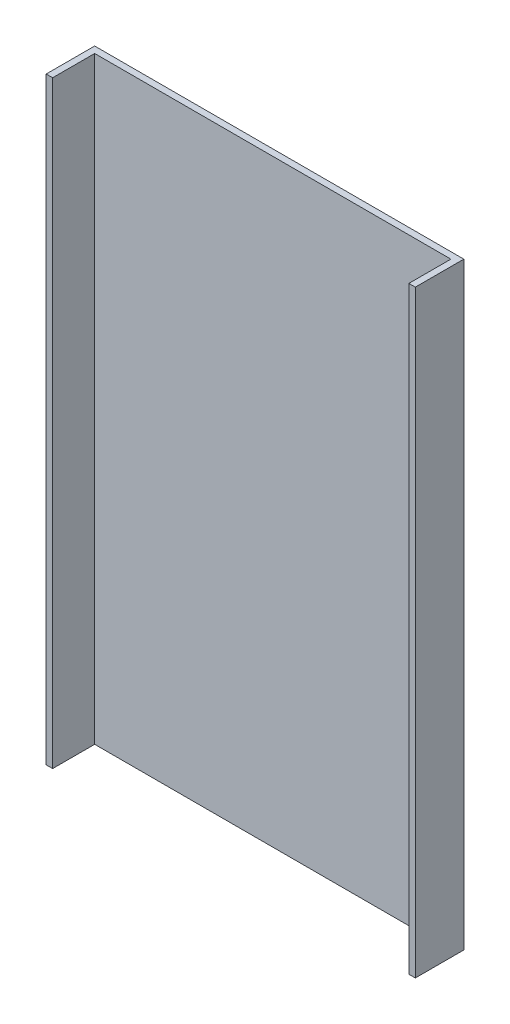
ISO-10303-21;
HEADER;
FILE_DESCRIPTION(('STEP AP214'),'2;1');
FILE_NAME('part.step','',(''),(''),'','','');
FILE_SCHEMA(('AUTOMOTIVE_DESIGN { 1 0 10303 214 1 1 1 1 }'));
ENDSEC;
DATA;
#1=APPLICATION_CONTEXT('core data for automotive mechanical design processes');
#2=APPLICATION_PROTOCOL_DEFINITION('international standard','automotive_design',2000,#1);
#3=PRODUCT_CONTEXT('',#1,'mechanical');
#4=PRODUCT('Part','Part','',(#3));
#5=PRODUCT_RELATED_PRODUCT_CATEGORY('part','',(#4));
#6=PRODUCT_DEFINITION_FORMATION('','',#4);
#7=PRODUCT_DEFINITION_CONTEXT('part definition',#1,'design');
#8=PRODUCT_DEFINITION('design','',#6,#7);
#9=PRODUCT_DEFINITION_SHAPE('','',#8);
#10=(LENGTH_UNIT() NAMED_UNIT(*) SI_UNIT(.MILLI.,.METRE.));
#11=(NAMED_UNIT(*) PLANE_ANGLE_UNIT() SI_UNIT($,.RADIAN.));
#12=(NAMED_UNIT(*) SI_UNIT($,.STERADIAN.) SOLID_ANGLE_UNIT());
#13=UNCERTAINTY_MEASURE_WITH_UNIT(LENGTH_MEASURE(1.E-05),#10,'distance_accuracy_value','');
#14=(GEOMETRIC_REPRESENTATION_CONTEXT(3) GLOBAL_UNCERTAINTY_ASSIGNED_CONTEXT((#13)) GLOBAL_UNIT_ASSIGNED_CONTEXT((#10,
#11,#12)) REPRESENTATION_CONTEXT('',''));
#15=CARTESIAN_POINT('',(0.,0.,0.));
#16=DIRECTION('',(0.,0.,1.));
#17=DIRECTION('',(1.,0.,0.));
#18=AXIS2_PLACEMENT_3D('',#15,#16,#17);
#19=CARTESIAN_POINT('',(0.,0.,1.27));
#20=DIRECTION('',(0.,0.,-1.));
#21=DIRECTION('',(-1.,0.,0.));
#22=AXIS2_PLACEMENT_3D('',#19,#20,#21);
#23=PLANE('',#22);
#24=DIRECTION('',(0.,1.,0.));
#25=VECTOR('',#24,1.);
#26=CARTESIAN_POINT('',(1.27,117.44,1.27));
#27=LINE('',#26,#25);
#28=CARTESIAN_POINT('',(1.27000000000001,0.,1.27));
#29=VERTEX_POINT('',#28);
#30=CARTESIAN_POINT('',(1.27,117.44,1.27));
#31=VERTEX_POINT('',#30);
#32=EDGE_CURVE('E59',#29,#31,#27,.T.);
#33=ORIENTED_EDGE('',*,*,#32,.F.);
#34=DIRECTION('',(1.,0.,0.));
#35=VECTOR('',#34,1.);
#36=CARTESIAN_POINT('',(0.,0.,1.27));
#37=LINE('',#36,#35);
#38=CARTESIAN_POINT('',(71.19,0.,1.27));
#39=VERTEX_POINT('',#38);
#40=EDGE_CURVE('E149',#29,#39,#37,.T.);
#41=ORIENTED_EDGE('',*,*,#40,.T.);
#42=DIRECTION('',(0.,-1.,0.));
#43=VECTOR('',#42,1.);
#44=CARTESIAN_POINT('',(71.19,0.,1.27));
#45=LINE('',#44,#43);
#46=CARTESIAN_POINT('',(71.19,117.44,1.27));
#47=VERTEX_POINT('',#46);
#48=EDGE_CURVE('E54',#47,#39,#45,.T.);
#49=ORIENTED_EDGE('',*,*,#48,.F.);
#50=DIRECTION('',(-1.,0.,0.));
#51=VECTOR('',#50,1.);
#52=CARTESIAN_POINT('',(0.,117.44,1.27));
#53=LINE('',#52,#51);
#54=EDGE_CURVE('E151',#47,#31,#53,.T.);
#55=ORIENTED_EDGE('',*,*,#54,.T.);
#56=EDGE_LOOP('',(#33,#41,#49,#55));
#57=FACE_BOUND('',#56,.T.);
#58=ADVANCED_FACE('F39',(#57),#23,.F.);
#59=CARTESIAN_POINT('',(0.,0.,1.27));
#60=DIRECTION('',(1.,0.,0.));
#61=DIRECTION('',(0.,0.,-1.));
#62=AXIS2_PLACEMENT_3D('',#59,#60,#61);
#63=PLANE('',#62);
#64=DIRECTION('',(0.,-1.,0.));
#65=VECTOR('',#64,1.);
#66=CARTESIAN_POINT('',(0.,0.,0.));
#67=LINE('',#66,#65);
#68=CARTESIAN_POINT('',(0.,117.44,0.));
#69=VERTEX_POINT('',#68);
#70=CARTESIAN_POINT('',(0.,0.,0.));
#71=VERTEX_POINT('',#70);
#72=EDGE_CURVE('E108',#69,#71,#67,.T.);
#73=ORIENTED_EDGE('',*,*,#72,.T.);
#74=DIRECTION('',(0.,0.,-1.));
#75=VECTOR('',#74,1.);
#76=CARTESIAN_POINT('',(0.,0.,1.27));
#77=LINE('',#76,#75);
#78=CARTESIAN_POINT('',(0.,0.,9.52));
#79=VERTEX_POINT('',#78);
#80=EDGE_CURVE('E11',#79,#71,#77,.T.);
#81=ORIENTED_EDGE('',*,*,#80,.F.);
#82=DIRECTION('',(0.,-1.,0.));
#83=VECTOR('',#82,1.);
#84=CARTESIAN_POINT('',(0.,117.44,9.52));
#85=LINE('',#84,#83);
#86=CARTESIAN_POINT('',(0.,117.44,9.52));
#87=VERTEX_POINT('',#86);
#88=EDGE_CURVE('E106',#87,#79,#85,.T.);
#89=ORIENTED_EDGE('',*,*,#88,.F.);
#90=DIRECTION('',(0.,0.,-1.));
#91=VECTOR('',#90,1.);
#92=CARTESIAN_POINT('',(0.,117.44,1.27));
#93=LINE('',#92,#91);
#94=EDGE_CURVE('E154',#87,#69,#93,.T.);
#95=ORIENTED_EDGE('',*,*,#94,.T.);
#96=EDGE_LOOP('',(#73,#81,#89,#95));
#97=FACE_BOUND('',#96,.T.);
#98=ADVANCED_FACE('F41',(#97),#63,.F.);
#99=CARTESIAN_POINT('',(0.,0.,1.27));
#100=DIRECTION('',(0.,1.,0.));
#101=DIRECTION('',(0.,0.,1.));
#102=AXIS2_PLACEMENT_3D('',#99,#100,#101);
#103=PLANE('',#102);
#104=DIRECTION('',(1.,0.,0.));
#105=VECTOR('',#104,1.);
#106=CARTESIAN_POINT('',(0.,0.,0.));
#107=LINE('',#106,#105);
#108=CARTESIAN_POINT('',(72.46,0.,0.));
#109=VERTEX_POINT('',#108);
#110=EDGE_CURVE('E156',#71,#109,#107,.T.);
#111=ORIENTED_EDGE('',*,*,#110,.T.);
#112=DIRECTION('',(0.,0.,-1.));
#113=VECTOR('',#112,1.);
#114=CARTESIAN_POINT('',(72.46,0.,1.27));
#115=LINE('',#114,#113);
#116=CARTESIAN_POINT('',(72.46,0.,9.52));
#117=VERTEX_POINT('',#116);
#118=EDGE_CURVE('E47',#117,#109,#115,.T.);
#119=ORIENTED_EDGE('',*,*,#118,.F.);
#120=DIRECTION('',(1.,0.,0.));
#121=VECTOR('',#120,1.);
#122=CARTESIAN_POINT('',(72.46,0.,9.52));
#123=LINE('',#122,#121);
#124=CARTESIAN_POINT('',(71.19,0.,9.52));
#125=VERTEX_POINT('',#124);
#126=EDGE_CURVE('E138',#125,#117,#123,.T.);
#127=ORIENTED_EDGE('',*,*,#126,.F.);
#128=DIRECTION('',(0.,0.,-1.));
#129=VECTOR('',#128,1.);
#130=CARTESIAN_POINT('',(71.19,0.,9.52));
#131=LINE('',#130,#129);
#132=EDGE_CURVE('E135',#125,#39,#131,.T.);
#133=ORIENTED_EDGE('',*,*,#132,.T.);
#134=ORIENTED_EDGE('',*,*,#40,.F.);
#135=DIRECTION('',(0.,0.,-1.));
#136=VECTOR('',#135,1.);
#137=CARTESIAN_POINT('',(1.27000000000001,0.,9.52));
#138=LINE('',#137,#136);
#139=CARTESIAN_POINT('',(1.27000000000001,0.,9.52));
#140=VERTEX_POINT('',#139);
#141=EDGE_CURVE('E114',#140,#29,#138,.T.);
#142=ORIENTED_EDGE('',*,*,#141,.F.);
#143=DIRECTION('',(1.,0.,0.));
#144=VECTOR('',#143,1.);
#145=CARTESIAN_POINT('',(0.,0.,9.52));
#146=LINE('',#145,#144);
#147=EDGE_CURVE('E111',#79,#140,#146,.T.);
#148=ORIENTED_EDGE('',*,*,#147,.F.);
#149=ORIENTED_EDGE('',*,*,#80,.T.);
#150=EDGE_LOOP('',(#111,#119,#127,#133,#134,#142,#148,#149));
#151=FACE_BOUND('',#150,.T.);
#152=ADVANCED_FACE('F112',(#151),#103,.F.);
#153=CARTESIAN_POINT('',(72.46,0.,1.27));
#154=DIRECTION('',(-1.,0.,0.));
#155=DIRECTION('',(0.,0.,1.));
#156=AXIS2_PLACEMENT_3D('',#153,#154,#155);
#157=PLANE('',#156);
#158=DIRECTION('',(0.,1.,0.));
#159=VECTOR('',#158,1.);
#160=CARTESIAN_POINT('',(72.46,0.,0.));
#161=LINE('',#160,#159);
#162=CARTESIAN_POINT('',(72.46,117.44,0.));
#163=VERTEX_POINT('',#162);
#164=EDGE_CURVE('E158',#109,#163,#161,.T.);
#165=ORIENTED_EDGE('',*,*,#164,.T.);
#166=DIRECTION('',(0.,0.,-1.));
#167=VECTOR('',#166,1.);
#168=CARTESIAN_POINT('',(72.46,117.44,1.27));
#169=LINE('',#168,#167);
#170=CARTESIAN_POINT('',(72.46,117.44,9.52));
#171=VERTEX_POINT('',#170);
#172=EDGE_CURVE('E162',#171,#163,#169,.T.);
#173=ORIENTED_EDGE('',*,*,#172,.F.);
#174=DIRECTION('',(0.,1.,0.));
#175=VECTOR('',#174,1.);
#176=CARTESIAN_POINT('',(72.46,0.,9.52));
#177=LINE('',#176,#175);
#178=EDGE_CURVE('E140',#117,#171,#177,.T.);
#179=ORIENTED_EDGE('',*,*,#178,.F.);
#180=ORIENTED_EDGE('',*,*,#118,.T.);
#181=EDGE_LOOP('',(#165,#173,#179,#180));
#182=FACE_BOUND('',#181,.T.);
#183=ADVANCED_FACE('F168',(#182),#157,.F.);
#184=CARTESIAN_POINT('',(0.,117.44,1.27));
#185=DIRECTION('',(0.,-1.,0.));
#186=DIRECTION('',(0.,0.,-1.));
#187=AXIS2_PLACEMENT_3D('',#184,#185,#186);
#188=PLANE('',#187);
#189=DIRECTION('',(-1.,0.,0.));
#190=VECTOR('',#189,1.);
#191=CARTESIAN_POINT('',(0.,117.44,0.));
#192=LINE('',#191,#190);
#193=EDGE_CURVE('E152',#163,#69,#192,.T.);
#194=ORIENTED_EDGE('',*,*,#193,.T.);
#195=ORIENTED_EDGE('',*,*,#94,.F.);
#196=DIRECTION('',(-1.,0.,0.));
#197=VECTOR('',#196,1.);
#198=CARTESIAN_POINT('',(0.,117.44,9.52));
#199=LINE('',#198,#197);
#200=CARTESIAN_POINT('',(1.27,117.44,9.52));
#201=VERTEX_POINT('',#200);
#202=EDGE_CURVE('E122',#201,#87,#199,.T.);
#203=ORIENTED_EDGE('',*,*,#202,.F.);
#204=DIRECTION('',(0.,0.,-1.));
#205=VECTOR('',#204,1.);
#206=CARTESIAN_POINT('',(1.27,117.44,9.52));
#207=LINE('',#206,#205);
#208=EDGE_CURVE('E127',#201,#31,#207,.T.);
#209=ORIENTED_EDGE('',*,*,#208,.T.);
#210=ORIENTED_EDGE('',*,*,#54,.F.);
#211=DIRECTION('',(0.,0.,-1.));
#212=VECTOR('',#211,1.);
#213=CARTESIAN_POINT('',(71.19,117.44,9.52));
#214=LINE('',#213,#212);
#215=CARTESIAN_POINT('',(71.19,117.44,9.52));
#216=VERTEX_POINT('',#215);
#217=EDGE_CURVE('E132',#216,#47,#214,.T.);
#218=ORIENTED_EDGE('',*,*,#217,.F.);
#219=DIRECTION('',(-1.,0.,0.));
#220=VECTOR('',#219,1.);
#221=CARTESIAN_POINT('',(72.46,117.44,9.52));
#222=LINE('',#221,#220);
#223=EDGE_CURVE('E145',#171,#216,#222,.T.);
#224=ORIENTED_EDGE('',*,*,#223,.F.);
#225=ORIENTED_EDGE('',*,*,#172,.T.);
#226=EDGE_LOOP('',(#194,#195,#203,#209,#210,#218,#224,#225));
#227=FACE_BOUND('',#226,.T.);
#228=ADVANCED_FACE('F174',(#227),#188,.F.);
#229=CARTESIAN_POINT('',(0.,0.,0.));
#230=DIRECTION('',(0.,0.,-1.));
#231=DIRECTION('',(-1.,0.,0.));
#232=AXIS2_PLACEMENT_3D('',#229,#230,#231);
#233=PLANE('',#232);
#234=ORIENTED_EDGE('',*,*,#72,.F.);
#235=ORIENTED_EDGE('',*,*,#193,.F.);
#236=ORIENTED_EDGE('',*,*,#164,.F.);
#237=ORIENTED_EDGE('',*,*,#110,.F.);
#238=EDGE_LOOP('',(#234,#235,#236,#237));
#239=FACE_BOUND('',#238,.T.);
#240=ADVANCED_FACE('F172',(#239),#233,.T.);
#241=CARTESIAN_POINT('',(71.19,0.,9.52));
#242=DIRECTION('',(1.,0.,0.));
#243=DIRECTION('',(0.,0.,-1.));
#244=AXIS2_PLACEMENT_3D('',#241,#242,#243);
#245=PLANE('',#244);
#246=ORIENTED_EDGE('',*,*,#48,.T.);
#247=ORIENTED_EDGE('',*,*,#132,.F.);
#248=DIRECTION('',(0.,-1.,0.));
#249=VECTOR('',#248,1.);
#250=CARTESIAN_POINT('',(71.19,0.,9.52));
#251=LINE('',#250,#249);
#252=EDGE_CURVE('E143',#216,#125,#251,.T.);
#253=ORIENTED_EDGE('',*,*,#252,.F.);
#254=ORIENTED_EDGE('',*,*,#217,.T.);
#255=EDGE_LOOP('',(#246,#247,#253,#254));
#256=FACE_BOUND('',#255,.T.);
#257=ADVANCED_FACE('F182',(#256),#245,.F.);
#258=CARTESIAN_POINT('',(0.,0.,9.52));
#259=DIRECTION('',(0.,0.,1.));
#260=DIRECTION('',(1.,0.,0.));
#261=AXIS2_PLACEMENT_3D('',#258,#259,#260);
#262=PLANE('',#261);
#263=ORIENTED_EDGE('',*,*,#178,.T.);
#264=ORIENTED_EDGE('',*,*,#223,.T.);
#265=ORIENTED_EDGE('',*,*,#252,.T.);
#266=ORIENTED_EDGE('',*,*,#126,.T.);
#267=EDGE_LOOP('',(#263,#264,#265,#266));
#268=FACE_BOUND('',#267,.T.);
#269=ADVANCED_FACE('F179',(#268),#262,.T.);
#270=CARTESIAN_POINT('',(1.27,117.44,9.52));
#271=DIRECTION('',(-1.,0.,0.));
#272=DIRECTION('',(0.,-1.,0.));
#273=AXIS2_PLACEMENT_3D('',#270,#271,#272);
#274=PLANE('',#273);
#275=ORIENTED_EDGE('',*,*,#32,.T.);
#276=ORIENTED_EDGE('',*,*,#208,.F.);
#277=DIRECTION('',(0.,1.,0.));
#278=VECTOR('',#277,1.);
#279=CARTESIAN_POINT('',(1.27,117.44,9.52));
#280=LINE('',#279,#278);
#281=EDGE_CURVE('E117',#140,#201,#280,.T.);
#282=ORIENTED_EDGE('',*,*,#281,.F.);
#283=ORIENTED_EDGE('',*,*,#141,.T.);
#284=EDGE_LOOP('',(#275,#276,#282,#283));
#285=FACE_BOUND('',#284,.T.);
#286=ADVANCED_FACE('F189',(#285),#274,.F.);
#287=CARTESIAN_POINT('',(0.,0.,9.52));
#288=DIRECTION('',(0.,0.,1.));
#289=DIRECTION('',(1.,0.,0.));
#290=AXIS2_PLACEMENT_3D('',#287,#288,#289);
#291=PLANE('',#290);
#292=ORIENTED_EDGE('',*,*,#88,.T.);
#293=ORIENTED_EDGE('',*,*,#147,.T.);
#294=ORIENTED_EDGE('',*,*,#281,.T.);
#295=ORIENTED_EDGE('',*,*,#202,.T.);
#296=EDGE_LOOP('',(#292,#293,#294,#295));
#297=FACE_BOUND('',#296,.T.);
#298=ADVANCED_FACE('F120',(#297),#291,.T.);
#299=CLOSED_SHELL('',(#58,#98,#152,#183,#228,#240,#257,#269,#286,#298));
#300=MANIFOLD_SOLID_BREP('B2',#299);
#301=ADVANCED_BREP_SHAPE_REPRESENTATION('',(#18,#300),#14);
#302=SHAPE_DEFINITION_REPRESENTATION(#9,#301);
ENDSEC;
END-ISO-10303-21;
